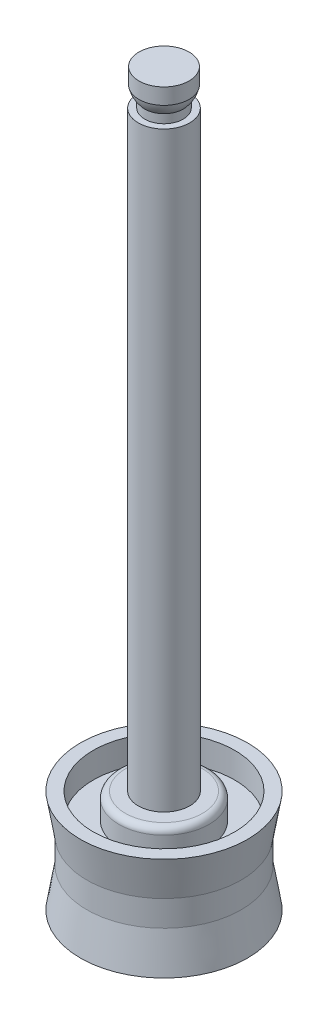
ISO-10303-21;
HEADER;
FILE_DESCRIPTION(('STEP AP214'),'2;1');
FILE_NAME('part.step','',(''),(''),'','','');
FILE_SCHEMA(('AUTOMOTIVE_DESIGN { 1 0 10303 214 1 1 1 1 }'));
ENDSEC;
DATA;
#1=APPLICATION_CONTEXT('core data for automotive mechanical design processes');
#2=APPLICATION_PROTOCOL_DEFINITION('international standard','automotive_design',2000,#1);
#3=PRODUCT_CONTEXT('',#1,'mechanical');
#4=PRODUCT('Part','Part','',(#3));
#5=PRODUCT_RELATED_PRODUCT_CATEGORY('part','',(#4));
#6=PRODUCT_DEFINITION_FORMATION('','',#4);
#7=PRODUCT_DEFINITION_CONTEXT('part definition',#1,'design');
#8=PRODUCT_DEFINITION('design','',#6,#7);
#9=PRODUCT_DEFINITION_SHAPE('','',#8);
#10=(LENGTH_UNIT() NAMED_UNIT(*) SI_UNIT(.MILLI.,.METRE.));
#11=(NAMED_UNIT(*) PLANE_ANGLE_UNIT() SI_UNIT($,.RADIAN.));
#12=(NAMED_UNIT(*) SI_UNIT($,.STERADIAN.) SOLID_ANGLE_UNIT());
#13=UNCERTAINTY_MEASURE_WITH_UNIT(LENGTH_MEASURE(1.E-05),#10,'distance_accuracy_value','');
#14=(GEOMETRIC_REPRESENTATION_CONTEXT(3) GLOBAL_UNCERTAINTY_ASSIGNED_CONTEXT((#13)) GLOBAL_UNIT_ASSIGNED_CONTEXT((#10,
#11,#12)) REPRESENTATION_CONTEXT('',''));
#15=CARTESIAN_POINT('',(0.,0.,0.));
#16=DIRECTION('',(0.,0.,1.));
#17=DIRECTION('',(1.,0.,0.));
#18=AXIS2_PLACEMENT_3D('',#15,#16,#17);
#19=CARTESIAN_POINT('',(0.,8.,0.));
#20=DIRECTION('',(0.,1.,0.));
#21=DIRECTION('',(0.,0.,1.));
#22=AXIS2_PLACEMENT_3D('',#19,#20,#21);
#23=PLANE('',#22);
#24=CARTESIAN_POINT('',(0.,8.,0.));
#25=DIRECTION('',(0.,1.,0.));
#26=DIRECTION('',(0.,0.,1.));
#27=AXIS2_PLACEMENT_3D('',#24,#25,#26);
#28=CIRCLE('',#27,5.5);
#29=CARTESIAN_POINT('',(0.,8.,5.5));
#30=VERTEX_POINT('',#29);
#31=EDGE_CURVE('E94',#30,#30,#28,.T.);
#32=ORIENTED_EDGE('',*,*,#31,.F.);
#33=EDGE_LOOP('',(#32));
#34=FACE_BOUND('',#33,.T.);
#35=CARTESIAN_POINT('',(0.,8.,0.));
#36=DIRECTION('',(0.,-1.,0.));
#37=DIRECTION('',(0.,0.,-1.));
#38=AXIS2_PLACEMENT_3D('',#35,#36,#37);
#39=CIRCLE('',#38,6.5);
#40=CARTESIAN_POINT('',(0.,8.,-6.5));
#41=VERTEX_POINT('',#40);
#42=EDGE_CURVE('E72',#41,#41,#39,.T.);
#43=ORIENTED_EDGE('',*,*,#42,.F.);
#44=EDGE_LOOP('',(#43));
#45=FACE_BOUND('',#44,.T.);
#46=ADVANCED_FACE('F34',(#34,#45),#23,.T.);
#47=CARTESIAN_POINT('',(0.,5.,0.));
#48=DIRECTION('',(0.,1.,0.));
#49=DIRECTION('',(0.,0.,1.));
#50=AXIS2_PLACEMENT_3D('',#47,#48,#49);
#51=CONICAL_SURFACE('',#50,6.,0.165148677414627);
#52=ORIENTED_EDGE('',*,*,#42,.T.);
#53=EDGE_LOOP('',(#52));
#54=FACE_BOUND('',#53,.T.);
#55=CARTESIAN_POINT('',(0.,5.,0.));
#56=DIRECTION('',(0.,-1.,0.));
#57=DIRECTION('',(0.,0.,-1.));
#58=AXIS2_PLACEMENT_3D('',#55,#56,#57);
#59=CIRCLE('',#58,6.);
#60=CARTESIAN_POINT('',(0.,5.,-6.));
#61=VERTEX_POINT('',#60);
#62=EDGE_CURVE('E81',#61,#61,#59,.T.);
#63=ORIENTED_EDGE('',*,*,#62,.F.);
#64=EDGE_LOOP('',(#63));
#65=FACE_BOUND('',#64,.T.);
#66=ADVANCED_FACE('F120',(#54,#65),#51,.T.);
#67=CARTESIAN_POINT('',(0.,0.,0.));
#68=DIRECTION('',(0.,-1.,0.));
#69=DIRECTION('',(0.,0.,-1.));
#70=AXIS2_PLACEMENT_3D('',#67,#68,#69);
#71=CONICAL_SURFACE('',#70,6.5,0.165148677414627);
#72=CARTESIAN_POINT('',(0.,3.,0.));
#73=DIRECTION('',(0.,-1.,0.));
#74=DIRECTION('',(0.,0.,-1.));
#75=AXIS2_PLACEMENT_3D('',#72,#73,#74);
#76=CIRCLE('',#75,6.);
#77=CARTESIAN_POINT('',(0.,3.,-6.));
#78=VERTEX_POINT('',#77);
#79=EDGE_CURVE('E78',#78,#78,#76,.T.);
#80=ORIENTED_EDGE('',*,*,#79,.T.);
#81=EDGE_LOOP('',(#80));
#82=FACE_BOUND('',#81,.T.);
#83=CARTESIAN_POINT('',(0.,0.,0.));
#84=DIRECTION('',(0.,-1.,0.));
#85=DIRECTION('',(0.,0.,-1.));
#86=AXIS2_PLACEMENT_3D('',#83,#84,#85);
#87=CIRCLE('',#86,6.5);
#88=CARTESIAN_POINT('',(0.,0.,-6.5));
#89=VERTEX_POINT('',#88);
#90=EDGE_CURVE('E75',#89,#89,#87,.T.);
#91=ORIENTED_EDGE('',*,*,#90,.F.);
#92=EDGE_LOOP('',(#91));
#93=FACE_BOUND('',#92,.T.);
#94=ADVANCED_FACE('F127',(#82,#93),#71,.T.);
#95=CARTESIAN_POINT('',(0.,0.,0.));
#96=DIRECTION('',(0.,-1.,0.));
#97=DIRECTION('',(0.,0.,-1.));
#98=AXIS2_PLACEMENT_3D('',#95,#96,#97);
#99=CYLINDRICAL_SURFACE('',#98,6.);
#100=ORIENTED_EDGE('',*,*,#62,.T.);
#101=EDGE_LOOP('',(#100));
#102=FACE_BOUND('',#101,.T.);
#103=ORIENTED_EDGE('',*,*,#79,.F.);
#104=EDGE_LOOP('',(#103));
#105=FACE_BOUND('',#104,.T.);
#106=ADVANCED_FACE('F131',(#102,#105),#99,.T.);
#107=CARTESIAN_POINT('',(0.,0.,0.));
#108=DIRECTION('',(0.,1.,0.));
#109=DIRECTION('',(0.,0.,1.));
#110=AXIS2_PLACEMENT_3D('',#107,#108,#109);
#111=PLANE('',#110);
#112=CARTESIAN_POINT('',(0.,0.,0.));
#113=DIRECTION('',(0.,-1.,0.));
#114=DIRECTION('',(0.,0.,-1.));
#115=AXIS2_PLACEMENT_3D('',#112,#113,#114);
#116=CIRCLE('',#115,5.5);
#117=CARTESIAN_POINT('',(0.,0.,-5.5));
#118=VERTEX_POINT('',#117);
#119=EDGE_CURVE('E85',#118,#118,#116,.T.);
#120=ORIENTED_EDGE('',*,*,#119,.F.);
#121=EDGE_LOOP('',(#120));
#122=FACE_BOUND('',#121,.T.);
#123=ORIENTED_EDGE('',*,*,#90,.T.);
#124=EDGE_LOOP('',(#123));
#125=FACE_BOUND('',#124,.T.);
#126=ADVANCED_FACE('F134',(#122,#125),#111,.F.);
#127=CARTESIAN_POINT('',(0.,2.,0.));
#128=DIRECTION('',(0.,-1.,0.));
#129=DIRECTION('',(0.,0.,-1.));
#130=AXIS2_PLACEMENT_3D('',#127,#128,#129);
#131=CYLINDRICAL_SURFACE('',#130,5.5);
#132=CARTESIAN_POINT('',(0.,2.,0.));
#133=DIRECTION('',(0.,-1.,0.));
#134=DIRECTION('',(0.,0.,-1.));
#135=AXIS2_PLACEMENT_3D('',#132,#133,#134);
#136=CIRCLE('',#135,5.5);
#137=CARTESIAN_POINT('',(0.,2.,-5.5));
#138=VERTEX_POINT('',#137);
#139=EDGE_CURVE('E84',#138,#138,#136,.T.);
#140=ORIENTED_EDGE('',*,*,#139,.F.);
#141=EDGE_LOOP('',(#140));
#142=FACE_BOUND('',#141,.T.);
#143=ORIENTED_EDGE('',*,*,#119,.T.);
#144=EDGE_LOOP('',(#143));
#145=FACE_BOUND('',#144,.T.);
#146=ADVANCED_FACE('F144',(#142,#145),#131,.F.);
#147=CARTESIAN_POINT('',(0.,2.,0.));
#148=DIRECTION('',(0.,-1.,0.));
#149=DIRECTION('',(0.,0.,-1.));
#150=AXIS2_PLACEMENT_3D('',#147,#148,#149);
#151=PLANE('',#150);
#152=CARTESIAN_POINT('',(0.,2.,0.));
#153=DIRECTION('',(0.,-1.,0.));
#154=DIRECTION('',(0.,0.,-1.));
#155=AXIS2_PLACEMENT_3D('',#152,#153,#154);
#156=CIRCLE('',#155,3.5);
#157=CARTESIAN_POINT('',(0.,2.,-3.5));
#158=VERTEX_POINT('',#157);
#159=EDGE_CURVE('E88',#158,#158,#156,.T.);
#160=ORIENTED_EDGE('',*,*,#159,.F.);
#161=EDGE_LOOP('',(#160));
#162=FACE_BOUND('',#161,.T.);
#163=ORIENTED_EDGE('',*,*,#139,.T.);
#164=EDGE_LOOP('',(#163));
#165=FACE_BOUND('',#164,.T.);
#166=ADVANCED_FACE('F150',(#162,#165),#151,.T.);
#167=CARTESIAN_POINT('',(0.,2.,0.));
#168=DIRECTION('',(0.,-1.,0.));
#169=DIRECTION('',(0.,0.,-1.));
#170=AXIS2_PLACEMENT_3D('',#167,#168,#169);
#171=CYLINDRICAL_SURFACE('',#170,3.5);
#172=CARTESIAN_POINT('',(0.,0.5,0.));
#173=DIRECTION('',(0.,1.,0.));
#174=DIRECTION('',(0.,0.,1.));
#175=AXIS2_PLACEMENT_3D('',#172,#173,#174);
#176=CIRCLE('',#175,3.5);
#177=CARTESIAN_POINT('',(0.,0.5,3.5));
#178=VERTEX_POINT('',#177);
#179=EDGE_CURVE('E45',#178,#178,#176,.T.);
#180=ORIENTED_EDGE('',*,*,#179,.T.);
#181=EDGE_LOOP('',(#180));
#182=FACE_BOUND('',#181,.T.);
#183=ORIENTED_EDGE('',*,*,#159,.T.);
#184=EDGE_LOOP('',(#183));
#185=FACE_BOUND('',#184,.T.);
#186=ADVANCED_FACE('F155',(#182,#185),#171,.T.);
#187=CARTESIAN_POINT('',(0.,0.,0.));
#188=DIRECTION('',(0.,1.,0.));
#189=DIRECTION('',(0.,0.,1.));
#190=AXIS2_PLACEMENT_3D('',#187,#188,#189);
#191=CIRCLE('',#190,3.);
#192=CARTESIAN_POINT('',(0.,0.,3.));
#193=VERTEX_POINT('',#192);
#194=EDGE_CURVE('E49',#193,#193,#191,.F.);
#195=ORIENTED_EDGE('',*,*,#194,.T.);
#196=EDGE_LOOP('',(#195));
#197=FACE_BOUND('',#196,.T.);
#198=ADVANCED_FACE('F114',(#197),#111,.F.);
#199=CARTESIAN_POINT('',(0.,6.,0.));
#200=DIRECTION('',(0.,1.,0.));
#201=DIRECTION('',(0.,0.,1.));
#202=AXIS2_PLACEMENT_3D('',#199,#200,#201);
#203=CYLINDRICAL_SURFACE('',#202,5.5);
#204=CARTESIAN_POINT('',(0.,6.,0.));
#205=DIRECTION('',(0.,1.,0.));
#206=DIRECTION('',(0.,0.,1.));
#207=AXIS2_PLACEMENT_3D('',#204,#205,#206);
#208=CIRCLE('',#207,5.5);
#209=CARTESIAN_POINT('',(0.,6.,5.5));
#210=VERTEX_POINT('',#209);
#211=EDGE_CURVE('E93',#210,#210,#208,.T.);
#212=ORIENTED_EDGE('',*,*,#211,.F.);
#213=EDGE_LOOP('',(#212));
#214=FACE_BOUND('',#213,.T.);
#215=ORIENTED_EDGE('',*,*,#31,.T.);
#216=EDGE_LOOP('',(#215));
#217=FACE_BOUND('',#216,.T.);
#218=ADVANCED_FACE('F108',(#214,#217),#203,.F.);
#219=CARTESIAN_POINT('',(0.,6.,0.));
#220=DIRECTION('',(0.,1.,0.));
#221=DIRECTION('',(0.,0.,1.));
#222=AXIS2_PLACEMENT_3D('',#219,#220,#221);
#223=PLANE('',#222);
#224=CARTESIAN_POINT('',(0.,6.,0.));
#225=DIRECTION('',(0.,1.,0.));
#226=DIRECTION('',(0.,0.,1.));
#227=AXIS2_PLACEMENT_3D('',#224,#225,#226);
#228=CIRCLE('',#227,3.5);
#229=CARTESIAN_POINT('',(0.,6.,3.5));
#230=VERTEX_POINT('',#229);
#231=EDGE_CURVE('E97',#230,#230,#228,.T.);
#232=ORIENTED_EDGE('',*,*,#231,.F.);
#233=EDGE_LOOP('',(#232));
#234=FACE_BOUND('',#233,.T.);
#235=ORIENTED_EDGE('',*,*,#211,.T.);
#236=EDGE_LOOP('',(#235));
#237=FACE_BOUND('',#236,.T.);
#238=ADVANCED_FACE('F105',(#234,#237),#223,.T.);
#239=CARTESIAN_POINT('',(0.,6.,0.));
#240=DIRECTION('',(0.,1.,0.));
#241=DIRECTION('',(0.,0.,1.));
#242=AXIS2_PLACEMENT_3D('',#239,#240,#241);
#243=CYLINDRICAL_SURFACE('',#242,3.5);
#244=CARTESIAN_POINT('',(0.,7.5,0.));
#245=DIRECTION('',(0.,1.,0.));
#246=DIRECTION('',(0.,0.,1.));
#247=AXIS2_PLACEMENT_3D('',#244,#245,#246);
#248=CIRCLE('',#247,3.5);
#249=CARTESIAN_POINT('',(0.,7.5,3.5));
#250=VERTEX_POINT('',#249);
#251=EDGE_CURVE('E10',#250,#250,#248,.F.);
#252=ORIENTED_EDGE('',*,*,#251,.T.);
#253=EDGE_LOOP('',(#252));
#254=FACE_BOUND('',#253,.T.);
#255=ORIENTED_EDGE('',*,*,#231,.T.);
#256=EDGE_LOOP('',(#255));
#257=FACE_BOUND('',#256,.T.);
#258=ADVANCED_FACE('F103',(#254,#257),#243,.T.);
#259=CARTESIAN_POINT('',(0.,56.8,0.));
#260=DIRECTION('',(0.,1.,0.));
#261=DIRECTION('',(0.,0.,1.));
#262=AXIS2_PLACEMENT_3D('',#259,#260,#261);
#263=PLANE('',#262);
#264=CARTESIAN_POINT('',(0.,56.8,0.));
#265=DIRECTION('',(0.,-1.,0.));
#266=DIRECTION('',(0.,0.,-1.));
#267=AXIS2_PLACEMENT_3D('',#264,#265,#266);
#268=CIRCLE('',#267,1.95);
#269=CARTESIAN_POINT('',(0.,56.8,-1.95));
#270=VERTEX_POINT('',#269);
#271=EDGE_CURVE('E69',#270,#270,#268,.T.);
#272=ORIENTED_EDGE('',*,*,#271,.F.);
#273=EDGE_LOOP('',(#272));
#274=FACE_BOUND('',#273,.T.);
#275=ADVANCED_FACE('F185',(#274),#263,.T.);
#276=CARTESIAN_POINT('',(0.,54.,0.));
#277=DIRECTION('',(0.,-1.,0.));
#278=DIRECTION('',(0.,0.,-1.));
#279=AXIS2_PLACEMENT_3D('',#276,#277,#278);
#280=CYLINDRICAL_SURFACE('',#279,1.95);
#281=ORIENTED_EDGE('',*,*,#271,.T.);
#282=EDGE_LOOP('',(#281));
#283=FACE_BOUND('',#282,.T.);
#284=CARTESIAN_POINT('',(0.,55.5555902791342,0.));
#285=DIRECTION('',(0.,-1.,0.));
#286=DIRECTION('',(0.,0.,-1.));
#287=AXIS2_PLACEMENT_3D('',#284,#285,#286);
#288=CIRCLE('',#287,1.95);
#289=CARTESIAN_POINT('',(1.95,55.5555902791342,0.));
#290=VERTEX_POINT('',#289);
#291=EDGE_CURVE('E66',#290,#290,#288,.T.);
#292=ORIENTED_EDGE('',*,*,#291,.F.);
#293=EDGE_LOOP('',(#292));
#294=FACE_BOUND('',#293,.T.);
#295=ADVANCED_FACE('F188',(#283,#294),#280,.T.);
#296=CARTESIAN_POINT('',(0.,56.,0.));
#297=DIRECTION('',(0.,-1.,0.));
#298=DIRECTION('',(1.,0.,0.));
#299=AXIS2_PLACEMENT_3D('',#296,#297,#298);
#300=SPHERICAL_SURFACE('',#299,2.);
#301=CARTESIAN_POINT('',(0.,54.6771243444677,0.));
#302=DIRECTION('',(0.,-1.,0.));
#303=DIRECTION('',(0.,0.,-1.));
#304=AXIS2_PLACEMENT_3D('',#301,#302,#303);
#305=CIRCLE('',#304,1.5);
#306=CARTESIAN_POINT('',(1.5,54.6771243444677,0.));
#307=VERTEX_POINT('',#306);
#308=EDGE_CURVE('E61',#307,#307,#305,.T.);
#309=CARTESIAN_POINT('',(1.95,55.5555902791342,0.));
#310=CARTESIAN_POINT('',(1.94769158091677,55.545461267286,0.));
#311=CARTESIAN_POINT('',(1.94530422770812,55.5353502449114,0.));
#312=CARTESIAN_POINT('',(1.94037226287277,55.5151666269883,0.));
#313=CARTESIAN_POINT('',(1.93782765124607,55.5050940314399,0.));
#314=CARTESIAN_POINT('',(1.93258177940741,55.4849897150477,0.));
#315=CARTESIAN_POINT('',(1.92988051919545,55.474957994204,0.));
#316=CARTESIAN_POINT('',(1.92432200828981,55.4549378626743,0.));
#317=CARTESIAN_POINT('',(1.92146475759613,55.4449494519884,0.));
#318=CARTESIAN_POINT('',(1.91559495896774,55.4250183663802,0.));
#319=CARTESIAN_POINT('',(1.91258241103302,55.4150756914579,0.));
#320=CARTESIAN_POINT('',(1.90640274960837,55.3952384916976,0.));
#321=CARTESIAN_POINT('',(1.90323563611844,55.3853439668596,0.));
#322=CARTESIAN_POINT('',(1.89674761260514,55.3656054699444,0.));
#323=CARTESIAN_POINT('',(1.89342670258178,55.3557614978671,0.));
#324=CARTESIAN_POINT('',(1.88663189242225,55.3361264968611,0.));
#325=CARTESIAN_POINT('',(1.88315799228608,55.3263354679325,0.));
#326=CARTESIAN_POINT('',(1.8760580454577,55.3068087307593,0.));
#327=CARTESIAN_POINT('',(1.87243199876548,55.2970730225146,0.));
#328=CARTESIAN_POINT('',(1.86502863933094,55.2776592908104,0.));
#329=CARTESIAN_POINT('',(1.86125132658863,55.2679812673507,0.));
#330=CARTESIAN_POINT('',(1.85354635229047,55.2486852553103,0.));
#331=CARTESIAN_POINT('',(1.84961869073462,55.2390672667295,0.));
#332=CARTESIAN_POINT('',(1.84161397255509,55.2198936599621,0.));
#333=CARTESIAN_POINT('',(1.83753691593141,55.2103380417757,0.));
#334=CARTESIAN_POINT('',(1.82923439763915,55.1912914961674,0.));
#335=CARTESIAN_POINT('',(1.82500893597056,55.1818005687456,0.));
#336=CARTESIAN_POINT('',(1.81641063364831,55.1628857093283,0.));
#337=CARTESIAN_POINT('',(1.81203779299464,55.1534617773328,0.));
#338=CARTESIAN_POINT('',(1.80314579454975,55.1346831971613,0.));
#339=CARTESIAN_POINT('',(1.79862663675853,55.1253285489853,0.));
#340=CARTESIAN_POINT('',(1.78944310141596,55.1066908080221,0.));
#341=CARTESIAN_POINT('',(1.78477872386462,55.0974077152348,0.));
#342=CARTESIAN_POINT('',(1.77530588164261,55.0789153392426,0.));
#343=CARTESIAN_POINT('',(1.77049741697195,55.0697060560376,0.));
#344=CARTESIAN_POINT('',(1.76073756814051,55.0513635354805,0.));
#345=CARTESIAN_POINT('',(1.75578618397973,55.0422302981284,0.));
#346=CARTESIAN_POINT('',(1.74574169850207,55.0240420870814,0.));
#347=CARTESIAN_POINT('',(1.74064859718519,55.0149871133865,0.));
#348=CARTESIAN_POINT('',(1.73032191414222,54.996957628454,0.));
#349=CARTESIAN_POINT('',(1.72508833241614,54.9879831172164,0.));
#350=CARTESIAN_POINT('',(1.71448195941421,54.9701167364596,0.));
#351=CARTESIAN_POINT('',(1.70910916813838,54.9612248669405,0.));
#352=CARTESIAN_POINT('',(1.69822568070036,54.9435259288145,0.));
#353=CARTESIAN_POINT('',(1.69271498453819,54.9347188602076,0.));
#354=CARTESIAN_POINT('',(1.68155702547802,54.9171916625077,0.));
#355=CARTESIAN_POINT('',(1.67590976258003,54.9084715334147,0.));
#356=CARTESIAN_POINT('',(1.66448004136116,54.8911203322326,0.));
#357=CARTESIAN_POINT('',(1.65869758304028,54.8824892601436,0.));
#358=CARTESIAN_POINT('',(1.646998875117,54.8653182688348,0.));
#359=CARTESIAN_POINT('',(1.64108262551459,54.8567783496151,0.));
#360=CARTESIAN_POINT('',(1.62911777166081,54.8397917377733,0.));
#361=CARTESIAN_POINT('',(1.62306916740944,54.8313450451512,0.));
#362=CARTESIAN_POINT('',(1.61084107301865,54.8145469376044,0.));
#363=CARTESIAN_POINT('',(1.60466158287923,54.8061955226797,0.));
#364=CARTESIAN_POINT('',(1.59217321729725,54.789589998456,0.));
#365=CARTESIAN_POINT('',(1.58586434185469,54.7813358891571,0.));
#366=CARTESIAN_POINT('',(1.57311873751568,54.7649269806165,0.));
#367=CARTESIAN_POINT('',(1.56668200861923,54.7567721813749,0.));
#368=CARTESIAN_POINT('',(1.55368226084294,54.7405638727739,0.));
#369=CARTESIAN_POINT('',(1.54711924196311,54.7325103634145,0.));
#370=CARTESIAN_POINT('',(1.53386850621172,54.7165065916406,0.));
#371=CARTESIAN_POINT('',(1.52718078934017,54.708556329226,0.));
#372=CARTESIAN_POINT('',(1.51368228788461,54.69276097649,0.));
#373=CARTESIAN_POINT('',(1.5068715033006,54.6849158861685,0.));
#374=CARTESIAN_POINT('',(1.5,54.6771243444677,0.));
#375=B_SPLINE_CURVE_WITH_KNOTS('',3,(#309,#310,#311,#312,#313,#314,#315,#316,#317,#318,#319,
#320,#321,#322,#323,#324,#325,#326,#327,#328,#329,#330,#331,#332,#333,#334,#335,#336,#337,#338,
#339,#340,#341,#342,#343,#344,#345,#346,#347,#348,#349,#350,#351,#352,#353,#354,#355,#356,#357,
#358,#359,#360,#361,#362,#363,#364,#365,#366,#367,#368,#369,#370,#371,#372,#373,#374),
.UNSPECIFIED.,.F.,.F.,(4,2,2,2,2,2,2,2,2,2,2,2,2,2,2,2,2,2,2,2,2,2,2,2,2,2,2,2,2,2,2,2,4),(0.,
0.0311658698174695,0.0623317396349332,0.0934976094523945,0.124663479269864,0.155829349087324,
0.186995218904791,0.218161088722253,0.249326958539724,0.280492828357185,0.311658698174652,
0.342824567992112,0.373990437809579,0.405156307627044,0.436322177444509,0.467488047261975,
0.498653917079437,0.529819786896902,0.560985656714367,0.59215152653183,0.623317396349295,
0.654483266166764,0.685649135984225,0.716815005801692,0.747980875619154,0.779146745436622,
0.810312615254084,0.841478485071549,0.872644354889013,0.903810224706479,0.934976094523946,
0.966141964341407,0.99730783415887),.UNSPECIFIED.);
#376=EDGE_CURVE('BSEAM192',#290,#307,#375,.T.);
#377=ORIENTED_EDGE('',*,*,#291,.T.);
#378=ORIENTED_EDGE('',*,*,#308,.F.);
#379=ORIENTED_EDGE('',*,*,#376,.T.);
#380=ORIENTED_EDGE('',*,*,#376,.F.);
#381=EDGE_LOOP('',(#377,#379,#378,#380));
#382=FACE_BOUND('',#381,.T.);
#383=ADVANCED_FACE('F192',(#382),#300,.T.);
#384=CARTESIAN_POINT('',(0.,54.,0.));
#385=DIRECTION('',(0.,-1.,0.));
#386=DIRECTION('',(0.,0.,-1.));
#387=AXIS2_PLACEMENT_3D('',#384,#385,#386);
#388=CYLINDRICAL_SURFACE('',#387,1.5);
#389=ORIENTED_EDGE('',*,*,#308,.T.);
#390=EDGE_LOOP('',(#389));
#391=FACE_BOUND('',#390,.T.);
#392=CARTESIAN_POINT('',(0.,54.,0.));
#393=DIRECTION('',(0.,1.,0.));
#394=DIRECTION('',(0.,0.,1.));
#395=AXIS2_PLACEMENT_3D('',#392,#393,#394);
#396=CIRCLE('',#395,1.5);
#397=CARTESIAN_POINT('',(0.,54.,1.5));
#398=VERTEX_POINT('',#397);
#399=EDGE_CURVE('E54',#398,#398,#396,.T.);
#400=ORIENTED_EDGE('',*,*,#399,.T.);
#401=EDGE_LOOP('',(#400));
#402=FACE_BOUND('',#401,.T.);
#403=ADVANCED_FACE('F196',(#391,#402),#388,.T.);
#404=CARTESIAN_POINT('',(0.,54.,0.));
#405=DIRECTION('',(0.,1.,0.));
#406=DIRECTION('',(0.,0.,1.));
#407=AXIS2_PLACEMENT_3D('',#404,#405,#406);
#408=PLANE('',#407);
#409=ORIENTED_EDGE('',*,*,#399,.F.);
#410=EDGE_LOOP('',(#409));
#411=FACE_BOUND('',#410,.T.);
#412=CARTESIAN_POINT('',(0.,54.,0.));
#413=DIRECTION('',(0.,1.,0.));
#414=DIRECTION('',(0.,0.,1.));
#415=AXIS2_PLACEMENT_3D('',#412,#413,#414);
#416=CIRCLE('',#415,2.);
#417=CARTESIAN_POINT('',(0.,54.,2.));
#418=VERTEX_POINT('',#417);
#419=EDGE_CURVE('E57',#418,#418,#416,.T.);
#420=ORIENTED_EDGE('',*,*,#419,.T.);
#421=EDGE_LOOP('',(#420));
#422=FACE_BOUND('',#421,.T.);
#423=ADVANCED_FACE('F200',(#411,#422),#408,.T.);
#424=CARTESIAN_POINT('',(0.,54.,0.));
#425=DIRECTION('',(0.,-1.,0.));
#426=DIRECTION('',(0.,0.,-1.));
#427=AXIS2_PLACEMENT_3D('',#424,#425,#426);
#428=CYLINDRICAL_SURFACE('',#427,2.);
#429=ORIENTED_EDGE('',*,*,#419,.F.);
#430=EDGE_LOOP('',(#429));
#431=FACE_BOUND('',#430,.T.);
#432=CARTESIAN_POINT('',(0.,8.,0.));
#433=DIRECTION('',(0.,1.,0.));
#434=DIRECTION('',(0.,0.,1.));
#435=AXIS2_PLACEMENT_3D('',#432,#433,#434);
#436=CIRCLE('',#435,2.);
#437=CARTESIAN_POINT('',(0.,8.,2.));
#438=VERTEX_POINT('',#437);
#439=EDGE_CURVE('E58',#438,#438,#436,.T.);
#440=ORIENTED_EDGE('',*,*,#439,.T.);
#441=EDGE_LOOP('',(#440));
#442=FACE_BOUND('',#441,.T.);
#443=ADVANCED_FACE('F172',(#431,#442),#428,.T.);
#444=CARTESIAN_POINT('',(0.,8.,0.));
#445=DIRECTION('',(0.,1.,0.));
#446=DIRECTION('',(0.,0.,1.));
#447=AXIS2_PLACEMENT_3D('',#444,#445,#446);
#448=CIRCLE('',#447,3.);
#449=CARTESIAN_POINT('',(0.,8.,3.));
#450=VERTEX_POINT('',#449);
#451=EDGE_CURVE('E41',#450,#450,#448,.T.);
#452=ORIENTED_EDGE('',*,*,#451,.T.);
#453=EDGE_LOOP('',(#452));
#454=FACE_BOUND('',#453,.T.);
#455=ORIENTED_EDGE('',*,*,#439,.F.);
#456=EDGE_LOOP('',(#455));
#457=FACE_BOUND('',#456,.T.);
#458=ADVANCED_FACE('F122',(#454,#457),#23,.T.);
#459=CARTESIAN_POINT('',(0.,0.5,0.));
#460=DIRECTION('',(0.,1.,0.));
#461=DIRECTION('',(0.,0.,1.));
#462=AXIS2_PLACEMENT_3D('',#459,#460,#461);
#463=TOROIDAL_SURFACE('',#462,3.,0.5);
#464=ORIENTED_EDGE('',*,*,#179,.F.);
#465=EDGE_LOOP('',(#464));
#466=FACE_BOUND('',#465,.T.);
#467=ORIENTED_EDGE('',*,*,#194,.F.);
#468=EDGE_LOOP('',(#467));
#469=FACE_BOUND('',#468,.T.);
#470=ADVANCED_FACE('F164',(#466,#469),#463,.T.);
#471=CARTESIAN_POINT('',(0.,7.5,0.));
#472=DIRECTION('',(0.,1.,0.));
#473=DIRECTION('',(0.,0.,1.));
#474=AXIS2_PLACEMENT_3D('',#471,#472,#473);
#475=TOROIDAL_SURFACE('',#474,3.,0.5);
#476=ORIENTED_EDGE('',*,*,#251,.F.);
#477=EDGE_LOOP('',(#476));
#478=FACE_BOUND('',#477,.T.);
#479=ORIENTED_EDGE('',*,*,#451,.F.);
#480=EDGE_LOOP('',(#479));
#481=FACE_BOUND('',#480,.T.);
#482=ADVANCED_FACE('F36',(#478,#481),#475,.T.);
#483=CLOSED_SHELL('',(#46,#66,#94,#106,#126,#146,#166,#186,#198,#218,#238,#258,#275,#295,#383,
#403,#423,#443,#458,#470,#482));
#484=MANIFOLD_SOLID_BREP('B2',#483);
#485=ADVANCED_BREP_SHAPE_REPRESENTATION('',(#18,#484),#14);
#486=SHAPE_DEFINITION_REPRESENTATION(#9,#485);
ENDSEC;
END-ISO-10303-21;
